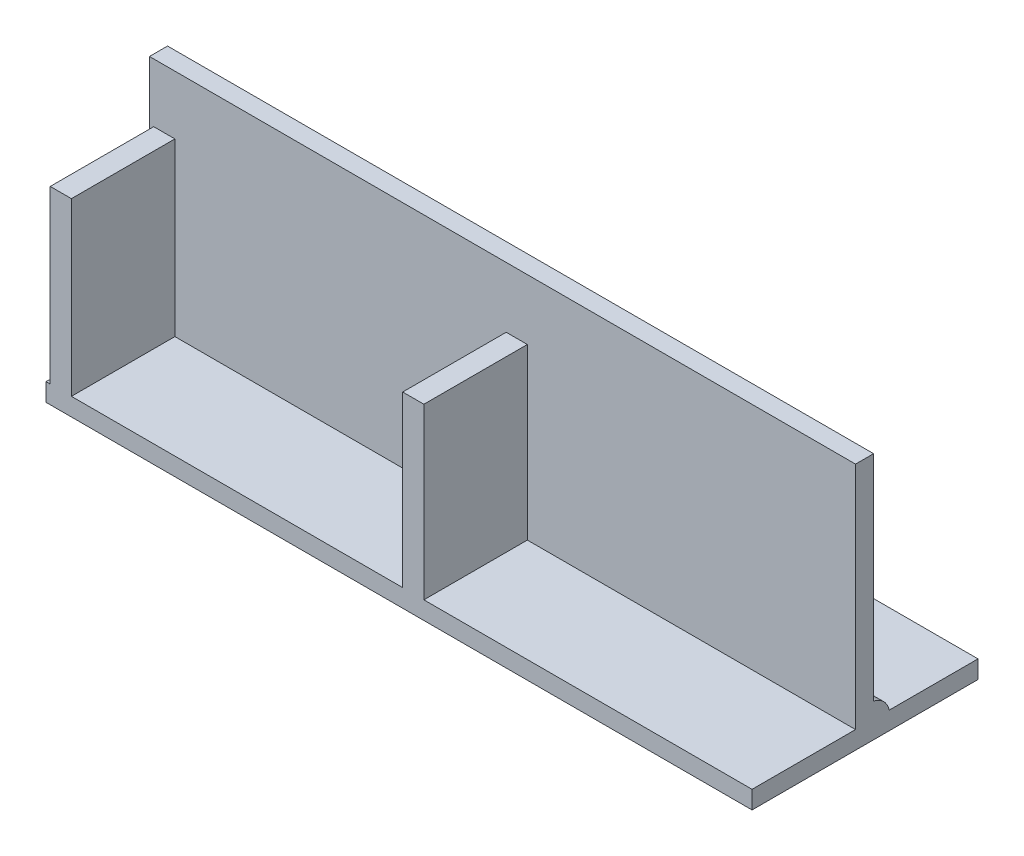
ISO-10303-21;
HEADER;
FILE_DESCRIPTION(('STEP AP214'),'2;1');
FILE_NAME('part.step','',(''),(''),'','','');
FILE_SCHEMA(('AUTOMOTIVE_DESIGN { 1 0 10303 214 1 1 1 1 }'));
ENDSEC;
DATA;
#1=APPLICATION_CONTEXT('core data for automotive mechanical design processes');
#2=APPLICATION_PROTOCOL_DEFINITION('international standard','automotive_design',2000,#1);
#3=PRODUCT_CONTEXT('',#1,'mechanical');
#4=PRODUCT('Part','Part','',(#3));
#5=PRODUCT_RELATED_PRODUCT_CATEGORY('part','',(#4));
#6=PRODUCT_DEFINITION_FORMATION('','',#4);
#7=PRODUCT_DEFINITION_CONTEXT('part definition',#1,'design');
#8=PRODUCT_DEFINITION('design','',#6,#7);
#9=PRODUCT_DEFINITION_SHAPE('','',#8);
#10=(LENGTH_UNIT() NAMED_UNIT(*) SI_UNIT(.MILLI.,.METRE.));
#11=(NAMED_UNIT(*) PLANE_ANGLE_UNIT() SI_UNIT($,.RADIAN.));
#12=(NAMED_UNIT(*) SI_UNIT($,.STERADIAN.) SOLID_ANGLE_UNIT());
#13=UNCERTAINTY_MEASURE_WITH_UNIT(LENGTH_MEASURE(1.E-05),#10,'distance_accuracy_value','');
#14=(GEOMETRIC_REPRESENTATION_CONTEXT(3) GLOBAL_UNCERTAINTY_ASSIGNED_CONTEXT((#13)) GLOBAL_UNIT_ASSIGNED_CONTEXT((#10,
#11,#12)) REPRESENTATION_CONTEXT('',''));
#15=CARTESIAN_POINT('',(0.,0.,0.));
#16=DIRECTION('',(0.,0.,1.));
#17=DIRECTION('',(1.,0.,0.));
#18=AXIS2_PLACEMENT_3D('',#15,#16,#17);
#19=CARTESIAN_POINT('',(0.,8.0518,0.));
#20=DIRECTION('',(0.,-1.,0.));
#21=DIRECTION('',(0.,0.,-1.));
#22=AXIS2_PLACEMENT_3D('',#19,#20,#21);
#23=PLANE('',#22);
#24=DIRECTION('',(-1.,0.,0.));
#25=VECTOR('',#24,1.);
#26=CARTESIAN_POINT('',(327.378281733176,8.0518,-61.6458));
#27=LINE('',#26,#25);
#28=CARTESIAN_POINT('',(317.5,8.0518,-61.6458));
#29=VERTEX_POINT('',#28);
#30=CARTESIAN_POINT('',(0.,8.0518,-61.6458));
#31=VERTEX_POINT('',#30);
#32=EDGE_CURVE('E52',#29,#31,#27,.T.);
#33=ORIENTED_EDGE('',*,*,#32,.F.);
#34=DIRECTION('',(0.,0.,-1.));
#35=VECTOR('',#34,1.);
#36=CARTESIAN_POINT('',(317.5,8.0518,0.));
#37=LINE('',#36,#35);
#38=CARTESIAN_POINT('',(317.5,8.0518,-101.6));
#39=VERTEX_POINT('',#38);
#40=EDGE_CURVE('E248',#29,#39,#37,.T.);
#41=ORIENTED_EDGE('',*,*,#40,.T.);
#42=DIRECTION('',(-1.,0.,0.));
#43=VECTOR('',#42,1.);
#44=CARTESIAN_POINT('',(0.,8.0518,-101.6));
#45=LINE('',#44,#43);
#46=CARTESIAN_POINT('',(0.,8.0518,-101.6));
#47=VERTEX_POINT('',#46);
#48=EDGE_CURVE('E253',#39,#47,#45,.T.);
#49=ORIENTED_EDGE('',*,*,#48,.T.);
#50=DIRECTION('',(0.,0.,1.));
#51=VECTOR('',#50,1.);
#52=CARTESIAN_POINT('',(0.,8.0518,0.));
#53=LINE('',#52,#51);
#54=EDGE_CURVE('E48',#47,#31,#53,.T.);
#55=ORIENTED_EDGE('',*,*,#54,.T.);
#56=EDGE_LOOP('',(#33,#41,#49,#55));
#57=FACE_BOUND('',#56,.T.);
#58=ADVANCED_FACE('F33',(#57),#23,.F.);
#59=CARTESIAN_POINT('',(0.,111.4298,-54.6608));
#60=DIRECTION('',(0.,0.,1.));
#61=DIRECTION('',(1.,0.,0.));
#62=AXIS2_PLACEMENT_3D('',#59,#60,#61);
#63=PLANE('',#62);
#64=DIRECTION('',(-1.,0.,0.));
#65=VECTOR('',#64,1.);
#66=CARTESIAN_POINT('',(327.378281733176,15.0368,-54.6608));
#67=LINE('',#66,#65);
#68=CARTESIAN_POINT('',(317.5,15.0368,-54.6608));
#69=VERTEX_POINT('',#68);
#70=CARTESIAN_POINT('',(0.,15.0368,-54.6608));
#71=VERTEX_POINT('',#70);
#72=EDGE_CURVE('E291',#69,#71,#67,.T.);
#73=ORIENTED_EDGE('',*,*,#72,.T.);
#74=DIRECTION('',(0.,-1.,0.));
#75=VECTOR('',#74,1.);
#76=CARTESIAN_POINT('',(0.,111.4298,-54.6608));
#77=LINE('',#76,#75);
#78=CARTESIAN_POINT('',(0.,111.4298,-54.6608));
#79=VERTEX_POINT('',#78);
#80=EDGE_CURVE('E239',#79,#71,#77,.T.);
#81=ORIENTED_EDGE('',*,*,#80,.F.);
#82=DIRECTION('',(-1.,0.,0.));
#83=VECTOR('',#82,1.);
#84=CARTESIAN_POINT('',(0.,111.4298,-54.6608));
#85=LINE('',#84,#83);
#86=CARTESIAN_POINT('',(317.5,111.4298,-54.6608));
#87=VERTEX_POINT('',#86);
#88=EDGE_CURVE('E218',#87,#79,#85,.T.);
#89=ORIENTED_EDGE('',*,*,#88,.F.);
#90=DIRECTION('',(0.,-1.,0.));
#91=VECTOR('',#90,1.);
#92=CARTESIAN_POINT('',(317.5,111.4298,-54.6608));
#93=LINE('',#92,#91);
#94=EDGE_CURVE('E228',#87,#69,#93,.T.);
#95=ORIENTED_EDGE('',*,*,#94,.T.);
#96=EDGE_LOOP('',(#73,#81,#89,#95));
#97=FACE_BOUND('',#96,.T.);
#98=ADVANCED_FACE('F302',(#97),#63,.F.);
#99=DIRECTION('',(0.,0.,-1.));
#100=VECTOR('',#99,1.);
#101=CARTESIAN_POINT('',(169.926,8.0518,0.));
#102=LINE('',#101,#100);
#103=CARTESIAN_POINT('',(169.926,8.0518,0.));
#104=VERTEX_POINT('',#103);
#105=CARTESIAN_POINT('',(169.926,8.0518,-46.5328));
#106=VERTEX_POINT('',#105);
#107=EDGE_CURVE('E182',#104,#106,#102,.T.);
#108=ORIENTED_EDGE('',*,*,#107,.F.);
#109=DIRECTION('',(1.,0.,0.));
#110=VECTOR('',#109,1.);
#111=CARTESIAN_POINT('',(0.,8.0518,0.));
#112=LINE('',#111,#110);
#113=CARTESIAN_POINT('',(317.5,8.0518,0.));
#114=VERTEX_POINT('',#113);
#115=EDGE_CURVE('E167',#104,#114,#112,.T.);
#116=ORIENTED_EDGE('',*,*,#115,.T.);
#117=CARTESIAN_POINT('',(317.5,8.0518,-46.5328));
#118=VERTEX_POINT('',#117);
#119=EDGE_CURVE('E250',#114,#118,#37,.T.);
#120=ORIENTED_EDGE('',*,*,#119,.T.);
#121=DIRECTION('',(1.,0.,0.));
#122=VECTOR('',#121,1.);
#123=CARTESIAN_POINT('',(0.,8.0518,-46.5328));
#124=LINE('',#123,#122);
#125=EDGE_CURVE('E217',#106,#118,#124,.T.);
#126=ORIENTED_EDGE('',*,*,#125,.F.);
#127=EDGE_LOOP('',(#108,#116,#120,#126));
#128=FACE_BOUND('',#127,.T.);
#129=ADVANCED_FACE('F304',(#128),#23,.F.);
#130=CARTESIAN_POINT('',(11.43,8.0518,0.));
#131=VERTEX_POINT('',#130);
#132=CARTESIAN_POINT('',(160.401,8.0518,0.));
#133=VERTEX_POINT('',#132);
#134=EDGE_CURVE('E249',#131,#133,#112,.T.);
#135=ORIENTED_EDGE('',*,*,#134,.T.);
#136=DIRECTION('',(0.,0.,-1.));
#137=VECTOR('',#136,1.);
#138=CARTESIAN_POINT('',(160.401,8.0518,0.));
#139=LINE('',#138,#137);
#140=CARTESIAN_POINT('',(160.401,8.0518,-46.5328));
#141=VERTEX_POINT('',#140);
#142=EDGE_CURVE('E177',#133,#141,#139,.T.);
#143=ORIENTED_EDGE('',*,*,#142,.T.);
#144=CARTESIAN_POINT('',(11.43,8.0518,-46.5328));
#145=VERTEX_POINT('',#144);
#146=EDGE_CURVE('E231',#145,#141,#124,.T.);
#147=ORIENTED_EDGE('',*,*,#146,.F.);
#148=DIRECTION('',(0.,0.,-1.));
#149=VECTOR('',#148,1.);
#150=CARTESIAN_POINT('',(11.43,8.0518,0.));
#151=LINE('',#150,#149);
#152=EDGE_CURVE('E189',#131,#145,#151,.T.);
#153=ORIENTED_EDGE('',*,*,#152,.F.);
#154=EDGE_LOOP('',(#135,#143,#147,#153));
#155=FACE_BOUND('',#154,.T.);
#156=ADVANCED_FACE('F313',(#155),#23,.F.);
#157=CARTESIAN_POINT('',(0.,111.4298,-46.5328));
#158=DIRECTION('',(0.,0.,-1.));
#159=DIRECTION('',(-1.,0.,0.));
#160=AXIS2_PLACEMENT_3D('',#157,#158,#159);
#161=PLANE('',#160);
#162=ORIENTED_EDGE('',*,*,#146,.T.);
#163=DIRECTION('',(0.,-1.,0.));
#164=VECTOR('',#163,1.);
#165=CARTESIAN_POINT('',(160.401,84.2264,-46.5328));
#166=LINE('',#165,#164);
#167=CARTESIAN_POINT('',(160.401,84.2264,-46.5328));
#168=VERTEX_POINT('',#167);
#169=EDGE_CURVE('E186',#168,#141,#166,.T.);
#170=ORIENTED_EDGE('',*,*,#169,.F.);
#171=DIRECTION('',(1.,0.,0.));
#172=VECTOR('',#171,1.);
#173=CARTESIAN_POINT('',(0.,84.2264,-46.5328));
#174=LINE('',#173,#172);
#175=CARTESIAN_POINT('',(169.926,84.2264,-46.5328));
#176=VERTEX_POINT('',#175);
#177=EDGE_CURVE('E175',#168,#176,#174,.T.);
#178=ORIENTED_EDGE('',*,*,#177,.T.);
#179=DIRECTION('',(0.,-1.,0.));
#180=VECTOR('',#179,1.);
#181=CARTESIAN_POINT('',(169.926,84.2264,-46.5328));
#182=LINE('',#181,#180);
#183=EDGE_CURVE('E172',#176,#106,#182,.T.);
#184=ORIENTED_EDGE('',*,*,#183,.T.);
#185=ORIENTED_EDGE('',*,*,#125,.T.);
#186=DIRECTION('',(0.,-1.,0.));
#187=VECTOR('',#186,1.);
#188=CARTESIAN_POINT('',(317.5,111.4298,-46.5328));
#189=LINE('',#188,#187);
#190=CARTESIAN_POINT('',(317.5,111.4298,-46.5328));
#191=VERTEX_POINT('',#190);
#192=EDGE_CURVE('E233',#191,#118,#189,.T.);
#193=ORIENTED_EDGE('',*,*,#192,.F.);
#194=DIRECTION('',(1.,0.,0.));
#195=VECTOR('',#194,1.);
#196=CARTESIAN_POINT('',(0.,111.4298,-46.5328));
#197=LINE('',#196,#195);
#198=CARTESIAN_POINT('',(0.,111.4298,-46.5328));
#199=VERTEX_POINT('',#198);
#200=EDGE_CURVE('E224',#199,#191,#197,.T.);
#201=ORIENTED_EDGE('',*,*,#200,.F.);
#202=DIRECTION('',(0.,-1.,0.));
#203=VECTOR('',#202,1.);
#204=CARTESIAN_POINT('',(0.,111.4298,-46.5328));
#205=LINE('',#204,#203);
#206=CARTESIAN_POINT('',(0.,8.0518,-46.5328));
#207=VERTEX_POINT('',#206);
#208=EDGE_CURVE('E236',#199,#207,#205,.T.);
#209=ORIENTED_EDGE('',*,*,#208,.T.);
#210=CARTESIAN_POINT('',(1.905,8.0518,-46.5328));
#211=VERTEX_POINT('',#210);
#212=EDGE_CURVE('E222',#207,#211,#124,.T.);
#213=ORIENTED_EDGE('',*,*,#212,.T.);
#214=DIRECTION('',(0.,-1.,0.));
#215=VECTOR('',#214,1.);
#216=CARTESIAN_POINT('',(1.905,85.0392,-46.5328));
#217=LINE('',#216,#215);
#218=CARTESIAN_POINT('',(1.905,85.0392,-46.5328));
#219=VERTEX_POINT('',#218);
#220=EDGE_CURVE('E210',#219,#211,#217,.T.);
#221=ORIENTED_EDGE('',*,*,#220,.F.);
#222=DIRECTION('',(1.,0.,0.));
#223=VECTOR('',#222,1.);
#224=CARTESIAN_POINT('',(0.,85.0392,-46.5328));
#225=LINE('',#224,#223);
#226=CARTESIAN_POINT('',(11.43,85.0392,-46.5328));
#227=VERTEX_POINT('',#226);
#228=EDGE_CURVE('E199',#219,#227,#225,.T.);
#229=ORIENTED_EDGE('',*,*,#228,.T.);
#230=DIRECTION('',(0.,-1.,0.));
#231=VECTOR('',#230,1.);
#232=CARTESIAN_POINT('',(11.43,85.0392,-46.5328));
#233=LINE('',#232,#231);
#234=EDGE_CURVE('E212',#227,#145,#233,.T.);
#235=ORIENTED_EDGE('',*,*,#234,.T.);
#236=EDGE_LOOP('',(#162,#170,#178,#184,#185,#193,#201,#209,#213,#221,#229,#235));
#237=FACE_BOUND('',#236,.T.);
#238=ADVANCED_FACE('F316',(#237),#161,.F.);
#239=CARTESIAN_POINT('',(0.,8.0518,0.));
#240=VERTEX_POINT('',#239);
#241=CARTESIAN_POINT('',(1.905,8.0518,0.));
#242=VERTEX_POINT('',#241);
#243=EDGE_CURVE('E245',#240,#242,#112,.T.);
#244=ORIENTED_EDGE('',*,*,#243,.T.);
#245=DIRECTION('',(0.,0.,-1.));
#246=VECTOR('',#245,1.);
#247=CARTESIAN_POINT('',(1.905,8.0518,0.));
#248=LINE('',#247,#246);
#249=EDGE_CURVE('E196',#242,#211,#248,.T.);
#250=ORIENTED_EDGE('',*,*,#249,.T.);
#251=ORIENTED_EDGE('',*,*,#212,.F.);
#252=EDGE_CURVE('E244',#207,#240,#53,.T.);
#253=ORIENTED_EDGE('',*,*,#252,.T.);
#254=EDGE_LOOP('',(#244,#250,#251,#253));
#255=FACE_BOUND('',#254,.T.);
#256=ADVANCED_FACE('F305',(#255),#23,.F.);
#257=CARTESIAN_POINT('',(0.,8.0518,0.));
#258=DIRECTION('',(1.,0.,0.));
#259=DIRECTION('',(0.,0.,-1.));
#260=AXIS2_PLACEMENT_3D('',#257,#258,#259);
#261=PLANE('',#260);
#262=CARTESIAN_POINT('',(0.,6.24571403736176,-52.8547140373618));
#263=DIRECTION('',(1.,0.,0.));
#264=DIRECTION('',(0.,0.,1.));
#265=AXIS2_PLACEMENT_3D('',#262,#263,#264);
#266=CIRCLE('',#265,8.97469436287019);
#267=EDGE_CURVE('E286',#31,#71,#266,.T.);
#268=ORIENTED_EDGE('',*,*,#267,.F.);
#269=ORIENTED_EDGE('',*,*,#54,.F.);
#270=DIRECTION('',(0.,-1.,0.));
#271=VECTOR('',#270,1.);
#272=CARTESIAN_POINT('',(0.,8.0518,-101.6));
#273=LINE('',#272,#271);
#274=CARTESIAN_POINT('',(0.,0.,-101.6));
#275=VERTEX_POINT('',#274);
#276=EDGE_CURVE('E255',#47,#275,#273,.T.);
#277=ORIENTED_EDGE('',*,*,#276,.T.);
#278=DIRECTION('',(0.,0.,1.));
#279=VECTOR('',#278,1.);
#280=CARTESIAN_POINT('',(0.,0.,0.));
#281=LINE('',#280,#279);
#282=CARTESIAN_POINT('',(0.,0.,0.));
#283=VERTEX_POINT('',#282);
#284=EDGE_CURVE('E242',#275,#283,#281,.T.);
#285=ORIENTED_EDGE('',*,*,#284,.T.);
#286=DIRECTION('',(0.,-1.,0.));
#287=VECTOR('',#286,1.);
#288=CARTESIAN_POINT('',(0.,8.0518,0.));
#289=LINE('',#288,#287);
#290=EDGE_CURVE('E11',#240,#283,#289,.T.);
#291=ORIENTED_EDGE('',*,*,#290,.F.);
#292=ORIENTED_EDGE('',*,*,#252,.F.);
#293=ORIENTED_EDGE('',*,*,#208,.F.);
#294=DIRECTION('',(0.,0.,1.));
#295=VECTOR('',#294,1.);
#296=CARTESIAN_POINT('',(0.,111.4298,0.));
#297=LINE('',#296,#295);
#298=EDGE_CURVE('E221',#79,#199,#297,.T.);
#299=ORIENTED_EDGE('',*,*,#298,.F.);
#300=ORIENTED_EDGE('',*,*,#80,.T.);
#301=EDGE_LOOP('',(#268,#269,#277,#285,#291,#292,#293,#299,#300));
#302=FACE_BOUND('',#301,.T.);
#303=ADVANCED_FACE('F35',(#302),#261,.F.);
#304=CARTESIAN_POINT('',(0.,8.0518,0.));
#305=DIRECTION('',(0.,0.,-1.));
#306=DIRECTION('',(-1.,0.,0.));
#307=AXIS2_PLACEMENT_3D('',#304,#305,#306);
#308=PLANE('',#307);
#309=DIRECTION('',(1.,0.,0.));
#310=VECTOR('',#309,1.);
#311=CARTESIAN_POINT('',(0.,0.,0.));
#312=LINE('',#311,#310);
#313=CARTESIAN_POINT('',(317.5,0.,0.));
#314=VERTEX_POINT('',#313);
#315=EDGE_CURVE('E258',#283,#314,#312,.T.);
#316=ORIENTED_EDGE('',*,*,#315,.T.);
#317=DIRECTION('',(0.,-1.,0.));
#318=VECTOR('',#317,1.);
#319=CARTESIAN_POINT('',(317.5,8.0518,0.));
#320=LINE('',#319,#318);
#321=EDGE_CURVE('E41',#114,#314,#320,.T.);
#322=ORIENTED_EDGE('',*,*,#321,.F.);
#323=ORIENTED_EDGE('',*,*,#115,.F.);
#324=DIRECTION('',(0.,-1.,0.));
#325=VECTOR('',#324,1.);
#326=CARTESIAN_POINT('',(169.926,84.2264,0.));
#327=LINE('',#326,#325);
#328=CARTESIAN_POINT('',(169.926,84.2264,0.));
#329=VERTEX_POINT('',#328);
#330=EDGE_CURVE('E164',#329,#104,#327,.T.);
#331=ORIENTED_EDGE('',*,*,#330,.F.);
#332=DIRECTION('',(1.,0.,0.));
#333=VECTOR('',#332,1.);
#334=CARTESIAN_POINT('',(0.,84.2264,0.));
#335=LINE('',#334,#333);
#336=CARTESIAN_POINT('',(160.401,84.2264,0.));
#337=VERTEX_POINT('',#336);
#338=EDGE_CURVE('E151',#337,#329,#335,.T.);
#339=ORIENTED_EDGE('',*,*,#338,.F.);
#340=DIRECTION('',(0.,-1.,0.));
#341=VECTOR('',#340,1.);
#342=CARTESIAN_POINT('',(160.401,84.2264,0.));
#343=LINE('',#342,#341);
#344=EDGE_CURVE('E171',#337,#133,#343,.T.);
#345=ORIENTED_EDGE('',*,*,#344,.T.);
#346=ORIENTED_EDGE('',*,*,#134,.F.);
#347=DIRECTION('',(0.,-1.,0.));
#348=VECTOR('',#347,1.);
#349=CARTESIAN_POINT('',(11.43,85.0392,0.));
#350=LINE('',#349,#348);
#351=CARTESIAN_POINT('',(11.43,85.0392,0.));
#352=VERTEX_POINT('',#351);
#353=EDGE_CURVE('E215',#352,#131,#350,.T.);
#354=ORIENTED_EDGE('',*,*,#353,.F.);
#355=DIRECTION('',(1.,0.,0.));
#356=VECTOR('',#355,1.);
#357=CARTESIAN_POINT('',(0.,85.0392,0.));
#358=LINE('',#357,#356);
#359=CARTESIAN_POINT('',(1.905,85.0392,0.));
#360=VERTEX_POINT('',#359);
#361=EDGE_CURVE('E192',#360,#352,#358,.T.);
#362=ORIENTED_EDGE('',*,*,#361,.F.);
#363=DIRECTION('',(0.,-1.,0.));
#364=VECTOR('',#363,1.);
#365=CARTESIAN_POINT('',(1.905,85.0392,0.));
#366=LINE('',#365,#364);
#367=EDGE_CURVE('E205',#360,#242,#366,.T.);
#368=ORIENTED_EDGE('',*,*,#367,.T.);
#369=ORIENTED_EDGE('',*,*,#243,.F.);
#370=ORIENTED_EDGE('',*,*,#290,.T.);
#371=EDGE_LOOP('',(#316,#322,#323,#331,#339,#345,#346,#354,#362,#368,#369,#370));
#372=FACE_BOUND('',#371,.T.);
#373=ADVANCED_FACE('F165',(#372),#308,.F.);
#374=CARTESIAN_POINT('',(317.5,8.0518,0.));
#375=DIRECTION('',(-1.,0.,0.));
#376=DIRECTION('',(0.,0.,1.));
#377=AXIS2_PLACEMENT_3D('',#374,#375,#376);
#378=PLANE('',#377);
#379=ORIENTED_EDGE('',*,*,#40,.F.);
#380=CARTESIAN_POINT('',(317.5,6.24571403736176,-52.8547140373618));
#381=DIRECTION('',(-1.,0.,0.));
#382=DIRECTION('',(0.,0.,1.));
#383=AXIS2_PLACEMENT_3D('',#380,#381,#382);
#384=CIRCLE('',#383,8.97469436287019);
#385=EDGE_CURVE('E184',#69,#29,#384,.T.);
#386=ORIENTED_EDGE('',*,*,#385,.F.);
#387=ORIENTED_EDGE('',*,*,#94,.F.);
#388=DIRECTION('',(0.,0.,-1.));
#389=VECTOR('',#388,1.);
#390=CARTESIAN_POINT('',(317.5,111.4298,0.));
#391=LINE('',#390,#389);
#392=EDGE_CURVE('E226',#191,#87,#391,.T.);
#393=ORIENTED_EDGE('',*,*,#392,.F.);
#394=ORIENTED_EDGE('',*,*,#192,.T.);
#395=ORIENTED_EDGE('',*,*,#119,.F.);
#396=ORIENTED_EDGE('',*,*,#321,.T.);
#397=DIRECTION('',(0.,0.,-1.));
#398=VECTOR('',#397,1.);
#399=CARTESIAN_POINT('',(317.5,0.,0.));
#400=LINE('',#399,#398);
#401=CARTESIAN_POINT('',(317.5,0.,-101.6));
#402=VERTEX_POINT('',#401);
#403=EDGE_CURVE('E260',#314,#402,#400,.T.);
#404=ORIENTED_EDGE('',*,*,#403,.T.);
#405=DIRECTION('',(0.,-1.,0.));
#406=VECTOR('',#405,1.);
#407=CARTESIAN_POINT('',(317.5,8.0518,-101.6));
#408=LINE('',#407,#406);
#409=EDGE_CURVE('E266',#39,#402,#408,.T.);
#410=ORIENTED_EDGE('',*,*,#409,.F.);
#411=EDGE_LOOP('',(#379,#386,#387,#393,#394,#395,#396,#404,#410));
#412=FACE_BOUND('',#411,.T.);
#413=ADVANCED_FACE('F272',(#412),#378,.F.);
#414=CARTESIAN_POINT('',(0.,8.0518,-101.6));
#415=DIRECTION('',(0.,0.,1.));
#416=DIRECTION('',(1.,0.,0.));
#417=AXIS2_PLACEMENT_3D('',#414,#415,#416);
#418=PLANE('',#417);
#419=DIRECTION('',(-1.,0.,0.));
#420=VECTOR('',#419,1.);
#421=CARTESIAN_POINT('',(0.,0.,-101.6));
#422=LINE('',#421,#420);
#423=EDGE_CURVE('E262',#402,#275,#422,.T.);
#424=ORIENTED_EDGE('',*,*,#423,.T.);
#425=ORIENTED_EDGE('',*,*,#276,.F.);
#426=ORIENTED_EDGE('',*,*,#48,.F.);
#427=ORIENTED_EDGE('',*,*,#409,.T.);
#428=EDGE_LOOP('',(#424,#425,#426,#427));
#429=FACE_BOUND('',#428,.T.);
#430=ADVANCED_FACE('F280',(#429),#418,.F.);
#431=CARTESIAN_POINT('',(0.,0.,0.));
#432=DIRECTION('',(0.,-1.,0.));
#433=DIRECTION('',(0.,0.,-1.));
#434=AXIS2_PLACEMENT_3D('',#431,#432,#433);
#435=PLANE('',#434);
#436=ORIENTED_EDGE('',*,*,#284,.F.);
#437=ORIENTED_EDGE('',*,*,#423,.F.);
#438=ORIENTED_EDGE('',*,*,#403,.F.);
#439=ORIENTED_EDGE('',*,*,#315,.F.);
#440=EDGE_LOOP('',(#436,#437,#438,#439));
#441=FACE_BOUND('',#440,.T.);
#442=ADVANCED_FACE('F277',(#441),#435,.T.);
#443=CARTESIAN_POINT('',(0.,111.4298,0.));
#444=DIRECTION('',(0.,1.,0.));
#445=DIRECTION('',(0.,0.,1.));
#446=AXIS2_PLACEMENT_3D('',#443,#444,#445);
#447=PLANE('',#446);
#448=ORIENTED_EDGE('',*,*,#88,.T.);
#449=ORIENTED_EDGE('',*,*,#298,.T.);
#450=ORIENTED_EDGE('',*,*,#200,.T.);
#451=ORIENTED_EDGE('',*,*,#392,.T.);
#452=EDGE_LOOP('',(#448,#449,#450,#451));
#453=FACE_BOUND('',#452,.T.);
#454=ADVANCED_FACE('F341',(#453),#447,.T.);
#455=CARTESIAN_POINT('',(11.43,85.0392,0.));
#456=DIRECTION('',(-1.,0.,0.));
#457=DIRECTION('',(0.,0.,1.));
#458=AXIS2_PLACEMENT_3D('',#455,#456,#457);
#459=PLANE('',#458);
#460=ORIENTED_EDGE('',*,*,#152,.T.);
#461=ORIENTED_EDGE('',*,*,#234,.F.);
#462=DIRECTION('',(0.,0.,-1.));
#463=VECTOR('',#462,1.);
#464=CARTESIAN_POINT('',(11.43,85.0392,0.));
#465=LINE('',#464,#463);
#466=EDGE_CURVE('E195',#352,#227,#465,.T.);
#467=ORIENTED_EDGE('',*,*,#466,.F.);
#468=ORIENTED_EDGE('',*,*,#353,.T.);
#469=EDGE_LOOP('',(#460,#461,#467,#468));
#470=FACE_BOUND('',#469,.T.);
#471=ADVANCED_FACE('F354',(#470),#459,.F.);
#472=CARTESIAN_POINT('',(1.905,85.0392,0.));
#473=DIRECTION('',(-1.,0.,0.));
#474=DIRECTION('',(0.,0.,1.));
#475=AXIS2_PLACEMENT_3D('',#472,#473,#474);
#476=PLANE('',#475);
#477=ORIENTED_EDGE('',*,*,#249,.F.);
#478=ORIENTED_EDGE('',*,*,#367,.F.);
#479=DIRECTION('',(0.,0.,-1.));
#480=VECTOR('',#479,1.);
#481=CARTESIAN_POINT('',(1.905,85.0392,0.));
#482=LINE('',#481,#480);
#483=EDGE_CURVE('E202',#360,#219,#482,.T.);
#484=ORIENTED_EDGE('',*,*,#483,.T.);
#485=ORIENTED_EDGE('',*,*,#220,.T.);
#486=EDGE_LOOP('',(#477,#478,#484,#485));
#487=FACE_BOUND('',#486,.T.);
#488=ADVANCED_FACE('F350',(#487),#476,.T.);
#489=CARTESIAN_POINT('',(0.,85.0392,0.));
#490=DIRECTION('',(0.,1.,0.));
#491=DIRECTION('',(0.,0.,1.));
#492=AXIS2_PLACEMENT_3D('',#489,#490,#491);
#493=PLANE('',#492);
#494=ORIENTED_EDGE('',*,*,#361,.T.);
#495=ORIENTED_EDGE('',*,*,#466,.T.);
#496=ORIENTED_EDGE('',*,*,#228,.F.);
#497=ORIENTED_EDGE('',*,*,#483,.F.);
#498=EDGE_LOOP('',(#494,#495,#496,#497));
#499=FACE_BOUND('',#498,.T.);
#500=ADVANCED_FACE('F352',(#499),#493,.T.);
#501=CARTESIAN_POINT('',(160.401,84.2264,0.));
#502=DIRECTION('',(-1.,0.,0.));
#503=DIRECTION('',(0.,0.,1.));
#504=AXIS2_PLACEMENT_3D('',#501,#502,#503);
#505=PLANE('',#504);
#506=ORIENTED_EDGE('',*,*,#142,.F.);
#507=ORIENTED_EDGE('',*,*,#344,.F.);
#508=DIRECTION('',(0.,0.,-1.));
#509=VECTOR('',#508,1.);
#510=CARTESIAN_POINT('',(160.401,84.2264,0.));
#511=LINE('',#510,#509);
#512=EDGE_CURVE('E159',#337,#168,#511,.T.);
#513=ORIENTED_EDGE('',*,*,#512,.T.);
#514=ORIENTED_EDGE('',*,*,#169,.T.);
#515=EDGE_LOOP('',(#506,#507,#513,#514));
#516=FACE_BOUND('',#515,.T.);
#517=ADVANCED_FACE('F336',(#516),#505,.T.);
#518=CARTESIAN_POINT('',(169.926,84.2264,0.));
#519=DIRECTION('',(-1.,0.,0.));
#520=DIRECTION('',(0.,0.,1.));
#521=AXIS2_PLACEMENT_3D('',#518,#519,#520);
#522=PLANE('',#521);
#523=ORIENTED_EDGE('',*,*,#107,.T.);
#524=ORIENTED_EDGE('',*,*,#183,.F.);
#525=DIRECTION('',(0.,0.,-1.));
#526=VECTOR('',#525,1.);
#527=CARTESIAN_POINT('',(169.926,84.2264,0.));
#528=LINE('',#527,#526);
#529=EDGE_CURVE('E156',#329,#176,#528,.T.);
#530=ORIENTED_EDGE('',*,*,#529,.F.);
#531=ORIENTED_EDGE('',*,*,#330,.T.);
#532=EDGE_LOOP('',(#523,#524,#530,#531));
#533=FACE_BOUND('',#532,.T.);
#534=ADVANCED_FACE('F174',(#533),#522,.F.);
#535=CARTESIAN_POINT('',(0.,84.2264,0.));
#536=DIRECTION('',(0.,1.,0.));
#537=DIRECTION('',(0.,0.,1.));
#538=AXIS2_PLACEMENT_3D('',#535,#536,#537);
#539=PLANE('',#538);
#540=ORIENTED_EDGE('',*,*,#177,.F.);
#541=ORIENTED_EDGE('',*,*,#512,.F.);
#542=ORIENTED_EDGE('',*,*,#338,.T.);
#543=ORIENTED_EDGE('',*,*,#529,.T.);
#544=EDGE_LOOP('',(#540,#541,#542,#543));
#545=FACE_BOUND('',#544,.T.);
#546=ADVANCED_FACE('F154',(#545),#539,.T.);
#547=CARTESIAN_POINT('',(327.378281733176,6.24571403736176,-52.8547140373618));
#548=DIRECTION('',(-1.,0.,0.));
#549=DIRECTION('',(0.,0.,1.));
#550=AXIS2_PLACEMENT_3D('',#547,#548,#549);
#551=CYLINDRICAL_SURFACE('',#550,8.97469436287019);
#552=ORIENTED_EDGE('',*,*,#72,.F.);
#553=ORIENTED_EDGE('',*,*,#385,.T.);
#554=ORIENTED_EDGE('',*,*,#32,.T.);
#555=ORIENTED_EDGE('',*,*,#267,.T.);
#556=EDGE_LOOP('',(#552,#553,#554,#555));
#557=FACE_BOUND('',#556,.T.);
#558=ADVANCED_FACE('F297',(#557),#551,.T.);
#559=CLOSED_SHELL('',(#58,#98,#129,#156,#238,#256,#303,#373,#413,#430,#442,#454,#471,#488,#500,
#517,#534,#546,#558));
#560=MANIFOLD_SOLID_BREP('B2',#559);
#561=ADVANCED_BREP_SHAPE_REPRESENTATION('',(#18,#560),#14);
#562=SHAPE_DEFINITION_REPRESENTATION(#9,#561);
ENDSEC;
END-ISO-10303-21;
